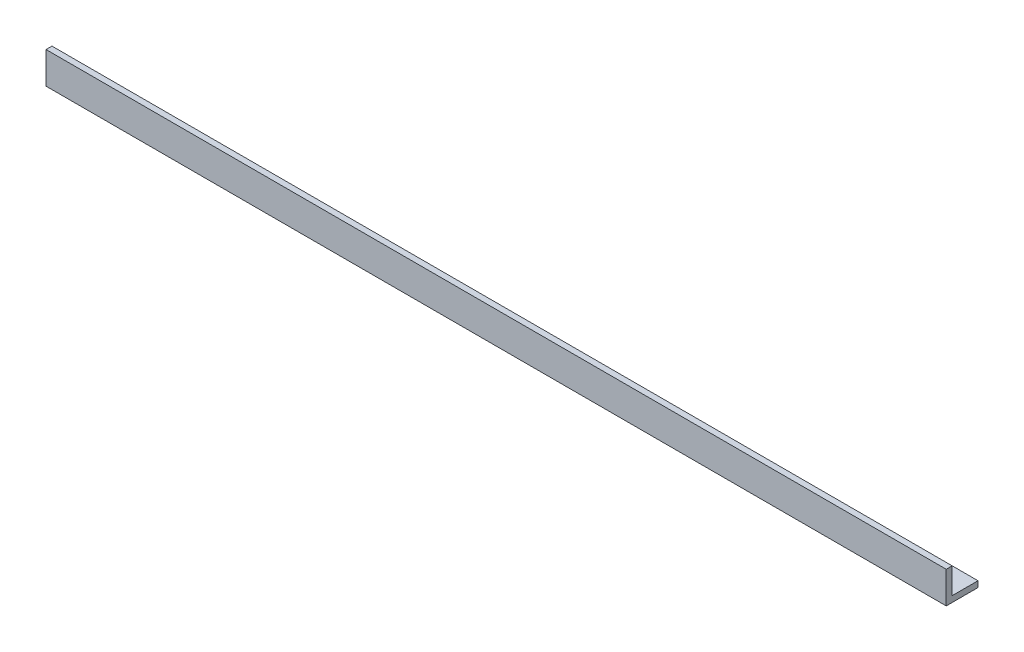
ISO-10303-21;
HEADER;
FILE_DESCRIPTION(('STEP AP214'),'2;1');
FILE_NAME('part.step','',(''),(''),'','','');
FILE_SCHEMA(('AUTOMOTIVE_DESIGN { 1 0 10303 214 1 1 1 1 }'));
ENDSEC;
DATA;
#1=APPLICATION_CONTEXT('core data for automotive mechanical design processes');
#2=APPLICATION_PROTOCOL_DEFINITION('international standard','automotive_design',2000,#1);
#3=PRODUCT_CONTEXT('',#1,'mechanical');
#4=PRODUCT('Part','Part','',(#3));
#5=PRODUCT_RELATED_PRODUCT_CATEGORY('part','',(#4));
#6=PRODUCT_DEFINITION_FORMATION('','',#4);
#7=PRODUCT_DEFINITION_CONTEXT('part definition',#1,'design');
#8=PRODUCT_DEFINITION('design','',#6,#7);
#9=PRODUCT_DEFINITION_SHAPE('','',#8);
#10=(LENGTH_UNIT() NAMED_UNIT(*) SI_UNIT(.MILLI.,.METRE.));
#11=(NAMED_UNIT(*) PLANE_ANGLE_UNIT() SI_UNIT($,.RADIAN.));
#12=(NAMED_UNIT(*) SI_UNIT($,.STERADIAN.) SOLID_ANGLE_UNIT());
#13=UNCERTAINTY_MEASURE_WITH_UNIT(LENGTH_MEASURE(1.E-05),#10,'distance_accuracy_value','');
#14=(GEOMETRIC_REPRESENTATION_CONTEXT(3) GLOBAL_UNCERTAINTY_ASSIGNED_CONTEXT((#13)) GLOBAL_UNIT_ASSIGNED_CONTEXT((#10,
#11,#12)) REPRESENTATION_CONTEXT('',''));
#15=CARTESIAN_POINT('',(0.,0.,0.));
#16=DIRECTION('',(0.,0.,1.));
#17=DIRECTION('',(1.,0.,0.));
#18=AXIS2_PLACEMENT_3D('',#15,#16,#17);
#19=CARTESIAN_POINT('',(720.09,0.,0.));
#20=DIRECTION('',(0.,-1.,0.));
#21=DIRECTION('',(0.,0.,-1.));
#22=AXIS2_PLACEMENT_3D('',#19,#20,#21);
#23=PLANE('',#22);
#24=DIRECTION('',(0.,0.,1.));
#25=VECTOR('',#24,1.);
#26=CARTESIAN_POINT('',(0.,0.,0.));
#27=LINE('',#26,#25);
#28=CARTESIAN_POINT('',(0.,0.,0.));
#29=VERTEX_POINT('',#28);
#30=CARTESIAN_POINT('',(0.,0.,4.7625));
#31=VERTEX_POINT('',#30);
#32=EDGE_CURVE('E117',#29,#31,#27,.T.);
#33=ORIENTED_EDGE('',*,*,#32,.T.);
#34=DIRECTION('',(-1.,0.,0.));
#35=VECTOR('',#34,1.);
#36=CARTESIAN_POINT('',(720.09,0.,4.7625));
#37=LINE('',#36,#35);
#38=CARTESIAN_POINT('',(720.09,0.,4.7625));
#39=VERTEX_POINT('',#38);
#40=EDGE_CURVE('E11',#39,#31,#37,.T.);
#41=ORIENTED_EDGE('',*,*,#40,.F.);
#42=DIRECTION('',(0.,0.,1.));
#43=VECTOR('',#42,1.);
#44=CARTESIAN_POINT('',(720.09,0.,0.));
#45=LINE('',#44,#43);
#46=CARTESIAN_POINT('',(720.09,0.,0.));
#47=VERTEX_POINT('',#46);
#48=EDGE_CURVE('E128',#47,#39,#45,.T.);
#49=ORIENTED_EDGE('',*,*,#48,.F.);
#50=DIRECTION('',(-1.,0.,0.));
#51=VECTOR('',#50,1.);
#52=CARTESIAN_POINT('',(720.09,0.,0.));
#53=LINE('',#52,#51);
#54=EDGE_CURVE('E113',#47,#29,#53,.T.);
#55=ORIENTED_EDGE('',*,*,#54,.T.);
#56=EDGE_LOOP('',(#33,#41,#49,#55));
#57=FACE_BOUND('',#56,.T.);
#58=ADVANCED_FACE('F33',(#57),#23,.F.);
#59=CARTESIAN_POINT('',(720.09,0.,4.7625));
#60=DIRECTION('',(0.,0.,-1.));
#61=DIRECTION('',(0.,1.,0.));
#62=AXIS2_PLACEMENT_3D('',#59,#60,#61);
#63=PLANE('',#62);
#64=DIRECTION('',(0.,-1.,0.));
#65=VECTOR('',#64,1.);
#66=CARTESIAN_POINT('',(0.,0.,4.7625));
#67=LINE('',#66,#65);
#68=CARTESIAN_POINT('',(0.,-25.4,4.7625));
#69=VERTEX_POINT('',#68);
#70=EDGE_CURVE('E120',#31,#69,#67,.T.);
#71=ORIENTED_EDGE('',*,*,#70,.T.);
#72=DIRECTION('',(-1.,0.,0.));
#73=VECTOR('',#72,1.);
#74=CARTESIAN_POINT('',(720.09,-25.4,4.7625));
#75=LINE('',#74,#73);
#76=CARTESIAN_POINT('',(720.09,-25.4,4.7625));
#77=VERTEX_POINT('',#76);
#78=EDGE_CURVE('E41',#77,#69,#75,.T.);
#79=ORIENTED_EDGE('',*,*,#78,.F.);
#80=DIRECTION('',(0.,-1.,0.));
#81=VECTOR('',#80,1.);
#82=CARTESIAN_POINT('',(720.09,0.,4.7625));
#83=LINE('',#82,#81);
#84=EDGE_CURVE('E86',#39,#77,#83,.T.);
#85=ORIENTED_EDGE('',*,*,#84,.F.);
#86=ORIENTED_EDGE('',*,*,#40,.T.);
#87=EDGE_LOOP('',(#71,#79,#85,#86));
#88=FACE_BOUND('',#87,.T.);
#89=ADVANCED_FACE('F153',(#88),#63,.F.);
#90=CARTESIAN_POINT('',(720.09,-25.4,4.7625));
#91=DIRECTION('',(0.,1.,0.));
#92=DIRECTION('',(0.,0.,1.));
#93=AXIS2_PLACEMENT_3D('',#90,#91,#92);
#94=PLANE('',#93);
#95=CARTESIAN_POINT('',(38.1,-25.4,-7.9375));
#96=DIRECTION('',(0.,1.,0.));
#97=DIRECTION('',(0.,0.,1.));
#98=AXIS2_PLACEMENT_3D('',#95,#96,#97);
#99=CIRCLE('',#98,3.175);
#100=CARTESIAN_POINT('',(38.1,-25.4,-4.7625));
#101=VERTEX_POINT('',#100);
#102=EDGE_CURVE('E121',#101,#101,#99,.F.);
#103=ORIENTED_EDGE('',*,*,#102,.F.);
#104=EDGE_LOOP('',(#103));
#105=FACE_BOUND('',#104,.T.);
#106=DIRECTION('',(0.,0.,-1.));
#107=VECTOR('',#106,1.);
#108=CARTESIAN_POINT('',(0.,-25.4,4.7625));
#109=LINE('',#108,#107);
#110=CARTESIAN_POINT('',(0.,-25.4,-20.6375));
#111=VERTEX_POINT('',#110);
#112=EDGE_CURVE('E123',#69,#111,#109,.T.);
#113=ORIENTED_EDGE('',*,*,#112,.T.);
#114=DIRECTION('',(-1.,0.,0.));
#115=VECTOR('',#114,1.);
#116=CARTESIAN_POINT('',(720.09,-25.4,-20.6375));
#117=LINE('',#116,#115);
#118=CARTESIAN_POINT('',(720.09,-25.4,-20.6375));
#119=VERTEX_POINT('',#118);
#120=EDGE_CURVE('E108',#119,#111,#117,.T.);
#121=ORIENTED_EDGE('',*,*,#120,.F.);
#122=DIRECTION('',(0.,0.,-1.));
#123=VECTOR('',#122,1.);
#124=CARTESIAN_POINT('',(720.09,-25.4,4.7625));
#125=LINE('',#124,#123);
#126=EDGE_CURVE('E99',#77,#119,#125,.T.);
#127=ORIENTED_EDGE('',*,*,#126,.F.);
#128=ORIENTED_EDGE('',*,*,#78,.T.);
#129=EDGE_LOOP('',(#113,#121,#127,#128));
#130=FACE_BOUND('',#129,.T.);
#131=ADVANCED_FACE('F134',(#105,#130),#94,.F.);
#132=CARTESIAN_POINT('',(720.09,-20.6375,-20.6375));
#133=DIRECTION('',(0.,0.,1.));
#134=DIRECTION('',(1.,0.,0.));
#135=AXIS2_PLACEMENT_3D('',#132,#133,#134);
#136=PLANE('',#135);
#137=DIRECTION('',(0.,1.,0.));
#138=VECTOR('',#137,1.);
#139=CARTESIAN_POINT('',(0.,-20.6375,-20.6375));
#140=LINE('',#139,#138);
#141=CARTESIAN_POINT('',(0.,-20.6375,-20.6375));
#142=VERTEX_POINT('',#141);
#143=EDGE_CURVE('E107',#111,#142,#140,.T.);
#144=ORIENTED_EDGE('',*,*,#143,.T.);
#145=DIRECTION('',(-1.,0.,0.));
#146=VECTOR('',#145,1.);
#147=CARTESIAN_POINT('',(720.09,-20.6375,-20.6375));
#148=LINE('',#147,#146);
#149=CARTESIAN_POINT('',(720.09,-20.6375,-20.6375));
#150=VERTEX_POINT('',#149);
#151=EDGE_CURVE('E104',#150,#142,#148,.T.);
#152=ORIENTED_EDGE('',*,*,#151,.F.);
#153=DIRECTION('',(0.,1.,0.));
#154=VECTOR('',#153,1.);
#155=CARTESIAN_POINT('',(720.09,-20.6375,-20.6375));
#156=LINE('',#155,#154);
#157=EDGE_CURVE('E93',#119,#150,#156,.T.);
#158=ORIENTED_EDGE('',*,*,#157,.F.);
#159=ORIENTED_EDGE('',*,*,#120,.T.);
#160=EDGE_LOOP('',(#144,#152,#158,#159));
#161=FACE_BOUND('',#160,.T.);
#162=ADVANCED_FACE('F105',(#161),#136,.F.);
#163=CARTESIAN_POINT('',(720.09,-20.6375,0.));
#164=DIRECTION('',(0.,-1.,0.));
#165=DIRECTION('',(0.,0.,-1.));
#166=AXIS2_PLACEMENT_3D('',#163,#164,#165);
#167=PLANE('',#166);
#168=CARTESIAN_POINT('',(38.1,-20.6375,-7.9375));
#169=DIRECTION('',(0.,1.,0.));
#170=DIRECTION('',(0.,0.,1.));
#171=AXIS2_PLACEMENT_3D('',#168,#169,#170);
#172=CIRCLE('',#171,3.175);
#173=CARTESIAN_POINT('',(38.1,-20.6375,-4.7625));
#174=VERTEX_POINT('',#173);
#175=EDGE_CURVE('E208',#174,#174,#172,.T.);
#176=ORIENTED_EDGE('',*,*,#175,.F.);
#177=EDGE_LOOP('',(#176));
#178=FACE_BOUND('',#177,.T.);
#179=DIRECTION('',(0.,0.,1.));
#180=VECTOR('',#179,1.);
#181=CARTESIAN_POINT('',(0.,-20.6375,0.));
#182=LINE('',#181,#180);
#183=CARTESIAN_POINT('',(0.,-20.6375,0.));
#184=VERTEX_POINT('',#183);
#185=EDGE_CURVE('E72',#142,#184,#182,.T.);
#186=ORIENTED_EDGE('',*,*,#185,.T.);
#187=DIRECTION('',(-1.,0.,0.));
#188=VECTOR('',#187,1.);
#189=CARTESIAN_POINT('',(720.09,-20.6375,0.));
#190=LINE('',#189,#188);
#191=CARTESIAN_POINT('',(720.09,-20.6375,0.));
#192=VERTEX_POINT('',#191);
#193=EDGE_CURVE('E109',#192,#184,#190,.T.);
#194=ORIENTED_EDGE('',*,*,#193,.F.);
#195=DIRECTION('',(0.,0.,1.));
#196=VECTOR('',#195,1.);
#197=CARTESIAN_POINT('',(720.09,-20.6375,0.));
#198=LINE('',#197,#196);
#199=EDGE_CURVE('E97',#150,#192,#198,.T.);
#200=ORIENTED_EDGE('',*,*,#199,.F.);
#201=ORIENTED_EDGE('',*,*,#151,.T.);
#202=EDGE_LOOP('',(#186,#194,#200,#201));
#203=FACE_BOUND('',#202,.T.);
#204=ADVANCED_FACE('F111',(#178,#203),#167,.F.);
#205=CARTESIAN_POINT('',(720.09,0.,0.));
#206=DIRECTION('',(0.,0.,1.));
#207=DIRECTION('',(0.,-1.,0.));
#208=AXIS2_PLACEMENT_3D('',#205,#206,#207);
#209=PLANE('',#208);
#210=DIRECTION('',(0.,1.,0.));
#211=VECTOR('',#210,1.);
#212=CARTESIAN_POINT('',(0.,0.,0.));
#213=LINE('',#212,#211);
#214=EDGE_CURVE('E78',#184,#29,#213,.T.);
#215=ORIENTED_EDGE('',*,*,#214,.T.);
#216=ORIENTED_EDGE('',*,*,#54,.F.);
#217=DIRECTION('',(0.,1.,0.));
#218=VECTOR('',#217,1.);
#219=CARTESIAN_POINT('',(720.09,0.,0.));
#220=LINE('',#219,#218);
#221=EDGE_CURVE('E49',#192,#47,#220,.T.);
#222=ORIENTED_EDGE('',*,*,#221,.F.);
#223=ORIENTED_EDGE('',*,*,#193,.T.);
#224=EDGE_LOOP('',(#215,#216,#222,#223));
#225=FACE_BOUND('',#224,.T.);
#226=ADVANCED_FACE('F141',(#225),#209,.F.);
#227=CARTESIAN_POINT('',(720.09,0.,0.));
#228=DIRECTION('',(1.,0.,0.));
#229=DIRECTION('',(0.,0.,-1.));
#230=AXIS2_PLACEMENT_3D('',#227,#228,#229);
#231=PLANE('',#230);
#232=ORIENTED_EDGE('',*,*,#48,.T.);
#233=ORIENTED_EDGE('',*,*,#84,.T.);
#234=ORIENTED_EDGE('',*,*,#126,.T.);
#235=ORIENTED_EDGE('',*,*,#157,.T.);
#236=ORIENTED_EDGE('',*,*,#199,.T.);
#237=ORIENTED_EDGE('',*,*,#221,.T.);
#238=EDGE_LOOP('',(#232,#233,#234,#235,#236,#237));
#239=FACE_BOUND('',#238,.T.);
#240=ADVANCED_FACE('F95',(#239),#231,.T.);
#241=CARTESIAN_POINT('',(0.,0.,0.));
#242=DIRECTION('',(1.,0.,0.));
#243=DIRECTION('',(0.,0.,-1.));
#244=AXIS2_PLACEMENT_3D('',#241,#242,#243);
#245=PLANE('',#244);
#246=ORIENTED_EDGE('',*,*,#32,.F.);
#247=ORIENTED_EDGE('',*,*,#214,.F.);
#248=ORIENTED_EDGE('',*,*,#185,.F.);
#249=ORIENTED_EDGE('',*,*,#143,.F.);
#250=ORIENTED_EDGE('',*,*,#112,.F.);
#251=ORIENTED_EDGE('',*,*,#70,.F.);
#252=EDGE_LOOP('',(#246,#247,#248,#249,#250,#251));
#253=FACE_BOUND('',#252,.T.);
#254=ADVANCED_FACE('F137',(#253),#245,.F.);
#255=CARTESIAN_POINT('',(38.1,-25.401,-7.9375));
#256=DIRECTION('',(0.,1.,0.));
#257=DIRECTION('',(0.,0.,1.));
#258=AXIS2_PLACEMENT_3D('',#255,#256,#257);
#259=CYLINDRICAL_SURFACE('',#258,3.175);
#260=ORIENTED_EDGE('',*,*,#175,.T.);
#261=EDGE_LOOP('',(#260));
#262=FACE_BOUND('',#261,.T.);
#263=ORIENTED_EDGE('',*,*,#102,.T.);
#264=EDGE_LOOP('',(#263));
#265=FACE_BOUND('',#264,.T.);
#266=ADVANCED_FACE('F181',(#262,#265),#259,.F.);
#267=CLOSED_SHELL('',(#58,#89,#131,#162,#204,#226,#240,#254,#266));
#268=MANIFOLD_SOLID_BREP('B2',#267);
#269=ADVANCED_BREP_SHAPE_REPRESENTATION('',(#18,#268),#14);
#270=SHAPE_DEFINITION_REPRESENTATION(#9,#269);
ENDSEC;
END-ISO-10303-21;
